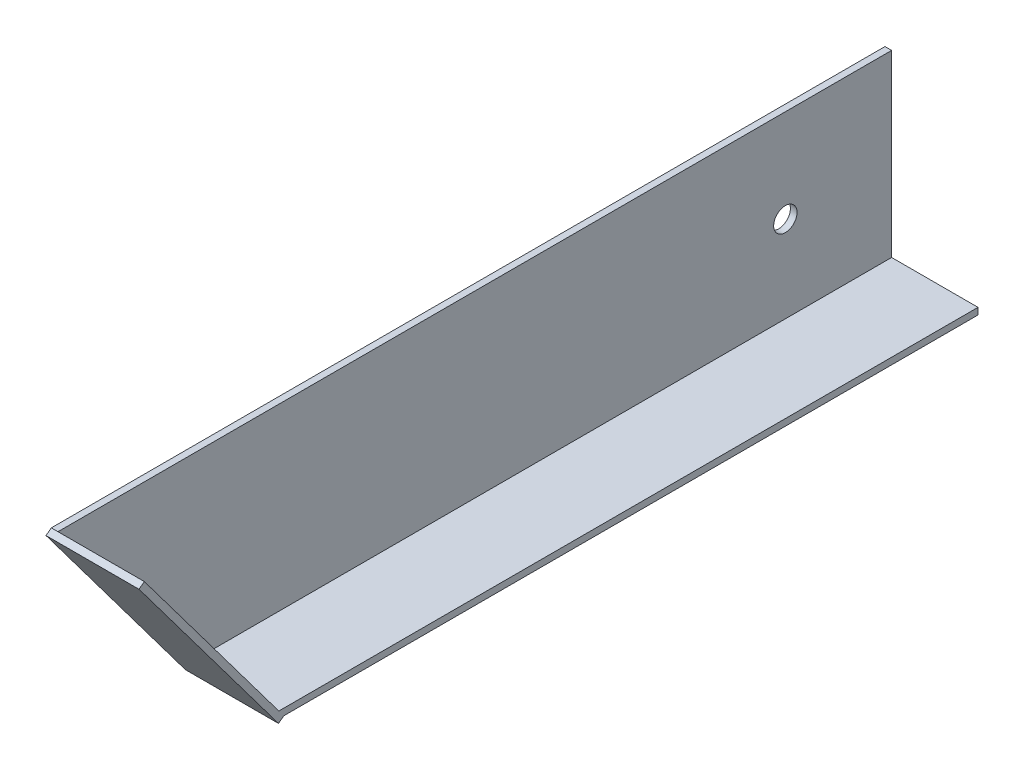
ISO-10303-21;
HEADER;
FILE_DESCRIPTION(('STEP AP214'),'2;1');
FILE_NAME('part.step','',(''),(''),'','','');
FILE_SCHEMA(('AUTOMOTIVE_DESIGN { 1 0 10303 214 1 1 1 1 }'));
ENDSEC;
DATA;
#1=APPLICATION_CONTEXT('core data for automotive mechanical design processes');
#2=APPLICATION_PROTOCOL_DEFINITION('international standard','automotive_design',2000,#1);
#3=PRODUCT_CONTEXT('',#1,'mechanical');
#4=PRODUCT('Part','Part','',(#3));
#5=PRODUCT_RELATED_PRODUCT_CATEGORY('part','',(#4));
#6=PRODUCT_DEFINITION_FORMATION('','',#4);
#7=PRODUCT_DEFINITION_CONTEXT('part definition',#1,'design');
#8=PRODUCT_DEFINITION('design','',#6,#7);
#9=PRODUCT_DEFINITION_SHAPE('','',#8);
#10=(LENGTH_UNIT() NAMED_UNIT(*) SI_UNIT(.MILLI.,.METRE.));
#11=(NAMED_UNIT(*) PLANE_ANGLE_UNIT() SI_UNIT($,.RADIAN.));
#12=(NAMED_UNIT(*) SI_UNIT($,.STERADIAN.) SOLID_ANGLE_UNIT());
#13=UNCERTAINTY_MEASURE_WITH_UNIT(LENGTH_MEASURE(1.E-05),#10,'distance_accuracy_value','');
#14=(GEOMETRIC_REPRESENTATION_CONTEXT(3) GLOBAL_UNCERTAINTY_ASSIGNED_CONTEXT((#13)) GLOBAL_UNIT_ASSIGNED_CONTEXT((#10,
#11,#12)) REPRESENTATION_CONTEXT('',''));
#15=CARTESIAN_POINT('',(0.,0.,0.));
#16=DIRECTION('',(0.,0.,1.));
#17=DIRECTION('',(1.,0.,0.));
#18=AXIS2_PLACEMENT_3D('',#15,#16,#17);
#19=CARTESIAN_POINT('',(0.,0.,199.23125));
#20=DIRECTION('',(1.,0.,0.));
#21=DIRECTION('',(0.,0.,-1.));
#22=AXIS2_PLACEMENT_3D('',#19,#20,#21);
#23=PLANE('',#22);
#24=DIRECTION('',(0.,0.,-1.));
#25=VECTOR('',#24,1.);
#26=CARTESIAN_POINT('',(0.,0.,199.23125));
#27=LINE('',#26,#25);
#28=CARTESIAN_POINT('',(0.,0.,132.556001855177));
#29=VERTEX_POINT('',#28);
#30=CARTESIAN_POINT('',(0.,0.,-199.23125));
#31=VERTEX_POINT('',#30);
#32=EDGE_CURVE('E11',#29,#31,#27,.T.);
#33=ORIENTED_EDGE('',*,*,#32,.F.);
#34=DIRECTION('',(0.,0.600001429132667,-0.799998928148505));
#35=VECTOR('',#34,1.);
#36=CARTESIAN_POINT('',(0.,-1.90500453749626,135.095998452048));
#37=LINE('',#36,#35);
#38=CARTESIAN_POINT('',(0.,-1.90500453749626,135.095998452048));
#39=VERTEX_POINT('',#38);
#40=EDGE_CURVE('E133',#39,#29,#37,.T.);
#41=ORIENTED_EDGE('',*,*,#40,.F.);
#42=DIRECTION('',(0.,-0.799998928148505,-0.600001429132667));
#43=VECTOR('',#42,1.);
#44=CARTESIAN_POINT('',(0.,-1.90500453749626,135.095998452048));
#45=LINE('',#44,#43);
#46=CARTESIAN_POINT('',(0.,86.9949954625037,201.771246596872));
#47=VERTEX_POINT('',#46);
#48=EDGE_CURVE('E149',#47,#39,#45,.T.);
#49=ORIENTED_EDGE('',*,*,#48,.F.);
#50=DIRECTION('',(0.,0.600001429132667,-0.799998928148505));
#51=VECTOR('',#50,1.);
#52=CARTESIAN_POINT('',(0.,86.9949954625037,201.771246596872));
#53=LINE('',#52,#51);
#54=CARTESIAN_POINT('',(0.,88.8999999999999,199.23125));
#55=VERTEX_POINT('',#54);
#56=EDGE_CURVE('E142',#47,#55,#53,.T.);
#57=ORIENTED_EDGE('',*,*,#56,.T.);
#58=DIRECTION('',(0.,0.,-1.));
#59=VECTOR('',#58,1.);
#60=CARTESIAN_POINT('',(0.,88.9,199.23125));
#61=LINE('',#60,#59);
#62=CARTESIAN_POINT('',(0.,88.9,-199.23125));
#63=VERTEX_POINT('',#62);
#64=EDGE_CURVE('E87',#55,#63,#61,.T.);
#65=ORIENTED_EDGE('',*,*,#64,.T.);
#66=DIRECTION('',(0.,-1.,0.));
#67=VECTOR('',#66,1.);
#68=CARTESIAN_POINT('',(0.,0.,-199.23125));
#69=LINE('',#68,#67);
#70=EDGE_CURVE('E93',#63,#31,#69,.T.);
#71=ORIENTED_EDGE('',*,*,#70,.T.);
#72=EDGE_LOOP('',(#33,#41,#49,#57,#65,#71));
#73=FACE_BOUND('',#72,.T.);
#74=CARTESIAN_POINT('',(0.,44.45,-148.43125));
#75=DIRECTION('',(1.,0.,0.));
#76=DIRECTION('',(0.,1.,0.));
#77=AXIS2_PLACEMENT_3D('',#74,#75,#76);
#78=CIRCLE('',#77,5.58800000000002);
#79=CARTESIAN_POINT('',(0.,50.038,-148.43125));
#80=VERTEX_POINT('',#79);
#81=EDGE_CURVE('E130',#80,#80,#78,.T.);
#82=ORIENTED_EDGE('',*,*,#81,.T.);
#83=EDGE_LOOP('',(#82));
#84=FACE_BOUND('',#83,.T.);
#85=ADVANCED_FACE('F33',(#73,#84),#23,.F.);
#86=CARTESIAN_POINT('',(0.,0.,199.23125));
#87=DIRECTION('',(0.,1.,0.));
#88=DIRECTION('',(0.,0.,1.));
#89=AXIS2_PLACEMENT_3D('',#86,#87,#88);
#90=PLANE('',#89);
#91=DIRECTION('',(-1.,0.,0.));
#92=VECTOR('',#91,1.);
#93=CARTESIAN_POINT('',(44.45,0.,132.556001855177));
#94=LINE('',#93,#92);
#95=CARTESIAN_POINT('',(44.45,0.,132.556001855177));
#96=VERTEX_POINT('',#95);
#97=EDGE_CURVE('E131',#96,#29,#94,.T.);
#98=ORIENTED_EDGE('',*,*,#97,.T.);
#99=ORIENTED_EDGE('',*,*,#32,.T.);
#100=DIRECTION('',(1.,0.,0.));
#101=VECTOR('',#100,1.);
#102=CARTESIAN_POINT('',(0.,0.,-199.23125));
#103=LINE('',#102,#101);
#104=CARTESIAN_POINT('',(44.45,0.,-199.23125));
#105=VERTEX_POINT('',#104);
#106=EDGE_CURVE('E118',#31,#105,#103,.T.);
#107=ORIENTED_EDGE('',*,*,#106,.T.);
#108=DIRECTION('',(0.,0.,-1.));
#109=VECTOR('',#108,1.);
#110=CARTESIAN_POINT('',(44.45,0.,199.23125));
#111=LINE('',#110,#109);
#112=EDGE_CURVE('E42',#96,#105,#111,.T.);
#113=ORIENTED_EDGE('',*,*,#112,.F.);
#114=EDGE_LOOP('',(#98,#99,#107,#113));
#115=FACE_BOUND('',#114,.T.);
#116=ADVANCED_FACE('F119',(#115),#90,.F.);
#117=CARTESIAN_POINT('',(44.45,0.,199.23125));
#118=DIRECTION('',(-1.,0.,0.));
#119=DIRECTION('',(0.,0.,1.));
#120=AXIS2_PLACEMENT_3D('',#117,#118,#119);
#121=PLANE('',#120);
#122=DIRECTION('',(0.,0.,-1.));
#123=VECTOR('',#122,1.);
#124=CARTESIAN_POINT('',(44.45,3.175,199.23125));
#125=LINE('',#124,#123);
#126=CARTESIAN_POINT('',(44.45,3.17500000000001,134.937260717492));
#127=VERTEX_POINT('',#126);
#128=CARTESIAN_POINT('',(44.45,3.175,-199.23125));
#129=VERTEX_POINT('',#128);
#130=EDGE_CURVE('E100',#127,#129,#125,.T.);
#131=ORIENTED_EDGE('',*,*,#130,.F.);
#132=DIRECTION('',(0.,0.799998928148505,0.600001429132667));
#133=VECTOR('',#132,1.);
#134=CARTESIAN_POINT('',(44.45,0.,132.556001855177));
#135=LINE('',#134,#133);
#136=CARTESIAN_POINT('',(44.45,88.8999999999999,199.23125));
#137=VERTEX_POINT('',#136);
#138=EDGE_CURVE('E150',#127,#137,#135,.T.);
#139=ORIENTED_EDGE('',*,*,#138,.T.);
#140=DIRECTION('',(0.,0.600001429132667,-0.799998928148505));
#141=VECTOR('',#140,1.);
#142=CARTESIAN_POINT('',(44.45,86.9949954625037,201.771246596872));
#143=LINE('',#142,#141);
#144=CARTESIAN_POINT('',(44.45,86.9949954625037,201.771246596872));
#145=VERTEX_POINT('',#144);
#146=EDGE_CURVE('E139',#145,#137,#143,.T.);
#147=ORIENTED_EDGE('',*,*,#146,.F.);
#148=DIRECTION('',(0.,0.799998928148505,0.600001429132667));
#149=VECTOR('',#148,1.);
#150=CARTESIAN_POINT('',(44.45,-1.90500453749626,135.095998452048));
#151=LINE('',#150,#149);
#152=CARTESIAN_POINT('',(44.45,-1.90500453749626,135.095998452048));
#153=VERTEX_POINT('',#152);
#154=EDGE_CURVE('E155',#153,#145,#151,.T.);
#155=ORIENTED_EDGE('',*,*,#154,.F.);
#156=DIRECTION('',(0.,0.600001429132667,-0.799998928148505));
#157=VECTOR('',#156,1.);
#158=CARTESIAN_POINT('',(44.45,-1.90500453749626,135.095998452048));
#159=LINE('',#158,#157);
#160=EDGE_CURVE('E114',#153,#96,#159,.T.);
#161=ORIENTED_EDGE('',*,*,#160,.T.);
#162=ORIENTED_EDGE('',*,*,#112,.T.);
#163=DIRECTION('',(0.,1.,0.));
#164=VECTOR('',#163,1.);
#165=CARTESIAN_POINT('',(44.45,0.,-199.23125));
#166=LINE('',#165,#164);
#167=EDGE_CURVE('E110',#105,#129,#166,.T.);
#168=ORIENTED_EDGE('',*,*,#167,.T.);
#169=EDGE_LOOP('',(#131,#139,#147,#155,#161,#162,#168));
#170=FACE_BOUND('',#169,.T.);
#171=ADVANCED_FACE('F108',(#170),#121,.F.);
#172=CARTESIAN_POINT('',(3.17500000000001,3.175,199.23125));
#173=DIRECTION('',(0.,-1.,0.));
#174=DIRECTION('',(0.,0.,-1.));
#175=AXIS2_PLACEMENT_3D('',#172,#173,#174);
#176=PLANE('',#175);
#177=DIRECTION('',(-1.,0.,0.));
#178=VECTOR('',#177,1.);
#179=CARTESIAN_POINT('',(3.175,3.175,134.937260717492));
#180=LINE('',#179,#178);
#181=CARTESIAN_POINT('',(3.17500000000001,3.175,134.937260717492));
#182=VERTEX_POINT('',#181);
#183=EDGE_CURVE('E125',#127,#182,#180,.T.);
#184=ORIENTED_EDGE('',*,*,#183,.F.);
#185=ORIENTED_EDGE('',*,*,#130,.T.);
#186=DIRECTION('',(-1.,0.,0.));
#187=VECTOR('',#186,1.);
#188=CARTESIAN_POINT('',(3.17500000000001,3.175,-199.23125));
#189=LINE('',#188,#187);
#190=CARTESIAN_POINT('',(3.17500000000001,3.175,-199.23125));
#191=VERTEX_POINT('',#190);
#192=EDGE_CURVE('E78',#129,#191,#189,.T.);
#193=ORIENTED_EDGE('',*,*,#192,.T.);
#194=DIRECTION('',(0.,0.,-1.));
#195=VECTOR('',#194,1.);
#196=CARTESIAN_POINT('',(3.17500000000001,3.175,199.23125));
#197=LINE('',#196,#195);
#198=EDGE_CURVE('E72',#182,#191,#197,.T.);
#199=ORIENTED_EDGE('',*,*,#198,.F.);
#200=EDGE_LOOP('',(#184,#185,#193,#199));
#201=FACE_BOUND('',#200,.T.);
#202=ADVANCED_FACE('F190',(#201),#176,.F.);
#203=CARTESIAN_POINT('',(3.175,88.9,199.23125));
#204=DIRECTION('',(-1.,0.,0.));
#205=DIRECTION('',(0.,-1.,0.));
#206=AXIS2_PLACEMENT_3D('',#203,#204,#205);
#207=PLANE('',#206);
#208=DIRECTION('',(0.,0.799998928148505,0.600001429132667));
#209=VECTOR('',#208,1.);
#210=CARTESIAN_POINT('',(3.175,88.9,199.23125));
#211=LINE('',#210,#209);
#212=CARTESIAN_POINT('',(3.175,88.9,199.23125));
#213=VERTEX_POINT('',#212);
#214=EDGE_CURVE('E128',#182,#213,#211,.T.);
#215=ORIENTED_EDGE('',*,*,#214,.F.);
#216=ORIENTED_EDGE('',*,*,#198,.T.);
#217=DIRECTION('',(0.,1.,0.));
#218=VECTOR('',#217,1.);
#219=CARTESIAN_POINT('',(3.175,88.9,-199.23125));
#220=LINE('',#219,#218);
#221=CARTESIAN_POINT('',(3.175,88.9,-199.23125));
#222=VERTEX_POINT('',#221);
#223=EDGE_CURVE('E68',#191,#222,#220,.T.);
#224=ORIENTED_EDGE('',*,*,#223,.T.);
#225=DIRECTION('',(0.,0.,-1.));
#226=VECTOR('',#225,1.);
#227=CARTESIAN_POINT('',(3.175,88.9,199.23125));
#228=LINE('',#227,#226);
#229=EDGE_CURVE('E49',#213,#222,#228,.T.);
#230=ORIENTED_EDGE('',*,*,#229,.F.);
#231=EDGE_LOOP('',(#215,#216,#224,#230));
#232=FACE_BOUND('',#231,.T.);
#233=CARTESIAN_POINT('',(3.175,44.45,-148.43125));
#234=DIRECTION('',(-1.,0.,0.));
#235=DIRECTION('',(0.,-1.,0.));
#236=AXIS2_PLACEMENT_3D('',#233,#234,#235);
#237=CIRCLE('',#236,5.58800000000002);
#238=CARTESIAN_POINT('',(3.17500000000001,38.862,-148.43125));
#239=VERTEX_POINT('',#238);
#240=EDGE_CURVE('E36',#239,#239,#237,.F.);
#241=ORIENTED_EDGE('',*,*,#240,.F.);
#242=EDGE_LOOP('',(#241));
#243=FACE_BOUND('',#242,.T.);
#244=ADVANCED_FACE('F69',(#232,#243),#207,.F.);
#245=CARTESIAN_POINT('',(0.,88.9,199.23125));
#246=DIRECTION('',(0.,-1.,0.));
#247=DIRECTION('',(0.,0.,-1.));
#248=AXIS2_PLACEMENT_3D('',#245,#246,#247);
#249=PLANE('',#248);
#250=DIRECTION('',(-1.,0.,0.));
#251=VECTOR('',#250,1.);
#252=CARTESIAN_POINT('',(0.,88.9,-199.23125));
#253=LINE('',#252,#251);
#254=EDGE_CURVE('E77',#222,#63,#253,.T.);
#255=ORIENTED_EDGE('',*,*,#254,.T.);
#256=ORIENTED_EDGE('',*,*,#64,.F.);
#257=DIRECTION('',(-1.,0.,0.));
#258=VECTOR('',#257,1.);
#259=CARTESIAN_POINT('',(0.,88.9,199.23125));
#260=LINE('',#259,#258);
#261=EDGE_CURVE('E85',#213,#55,#260,.T.);
#262=ORIENTED_EDGE('',*,*,#261,.F.);
#263=ORIENTED_EDGE('',*,*,#229,.T.);
#264=EDGE_LOOP('',(#255,#256,#262,#263));
#265=FACE_BOUND('',#264,.T.);
#266=ADVANCED_FACE('F81',(#265),#249,.F.);
#267=CARTESIAN_POINT('',(0.,0.,-199.23125));
#268=DIRECTION('',(0.,0.,-1.));
#269=DIRECTION('',(-1.,0.,0.));
#270=AXIS2_PLACEMENT_3D('',#267,#268,#269);
#271=PLANE('',#270);
#272=ORIENTED_EDGE('',*,*,#70,.F.);
#273=ORIENTED_EDGE('',*,*,#254,.F.);
#274=ORIENTED_EDGE('',*,*,#223,.F.);
#275=ORIENTED_EDGE('',*,*,#192,.F.);
#276=ORIENTED_EDGE('',*,*,#167,.F.);
#277=ORIENTED_EDGE('',*,*,#106,.F.);
#278=EDGE_LOOP('',(#272,#273,#274,#275,#276,#277));
#279=FACE_BOUND('',#278,.T.);
#280=ADVANCED_FACE('F90',(#279),#271,.T.);
#281=CARTESIAN_POINT('',(44.45,44.45,-148.43125));
#282=DIRECTION('',(-1.,0.,0.));
#283=DIRECTION('',(0.,-1.,0.));
#284=AXIS2_PLACEMENT_3D('',#281,#282,#283);
#285=CYLINDRICAL_SURFACE('',#284,5.58800000000002);
#286=ORIENTED_EDGE('',*,*,#81,.F.);
#287=EDGE_LOOP('',(#286));
#288=FACE_BOUND('',#287,.T.);
#289=ORIENTED_EDGE('',*,*,#240,.T.);
#290=EDGE_LOOP('',(#289));
#291=FACE_BOUND('',#290,.T.);
#292=ADVANCED_FACE('F225',(#288,#291),#285,.F.);
#293=CARTESIAN_POINT('',(0.,-63.6269471941627,84.8356138589076));
#294=DIRECTION('',(0.,0.600001429132667,-0.799998928148505));
#295=DIRECTION('',(0.,0.799998928148505,0.600001429132667));
#296=AXIS2_PLACEMENT_3D('',#293,#294,#295);
#297=PLANE('',#296);
#298=ORIENTED_EDGE('',*,*,#183,.T.);
#299=ORIENTED_EDGE('',*,*,#214,.T.);
#300=DIRECTION('',(-1.,0.,0.));
#301=VECTOR('',#300,1.);
#302=CARTESIAN_POINT('',(0.,88.8999999999999,199.23125));
#303=LINE('',#302,#301);
#304=EDGE_CURVE('E146',#137,#213,#303,.T.);
#305=ORIENTED_EDGE('',*,*,#304,.F.);
#306=ORIENTED_EDGE('',*,*,#138,.F.);
#307=EDGE_LOOP('',(#298,#299,#305,#306));
#308=FACE_BOUND('',#307,.T.);
#309=ADVANCED_FACE('F192',(#308),#297,.T.);
#310=CARTESIAN_POINT('',(0.,-1.90500453749626,135.095998452048));
#311=DIRECTION('',(0.,0.799998928148505,0.600001429132667));
#312=DIRECTION('',(0.,-0.600001429132668,0.799998928148505));
#313=AXIS2_PLACEMENT_3D('',#310,#311,#312);
#314=PLANE('',#313);
#315=ORIENTED_EDGE('',*,*,#97,.F.);
#316=ORIENTED_EDGE('',*,*,#160,.F.);
#317=DIRECTION('',(1.,0.,0.));
#318=VECTOR('',#317,1.);
#319=CARTESIAN_POINT('',(0.,-1.90500453749626,135.095998452048));
#320=LINE('',#319,#318);
#321=EDGE_CURVE('E158',#39,#153,#320,.T.);
#322=ORIENTED_EDGE('',*,*,#321,.F.);
#323=ORIENTED_EDGE('',*,*,#40,.T.);
#324=EDGE_LOOP('',(#315,#316,#322,#323));
#325=FACE_BOUND('',#324,.T.);
#326=ADVANCED_FACE('F178',(#325),#314,.F.);
#327=CARTESIAN_POINT('',(0.,86.9949954625037,201.771246596872));
#328=DIRECTION('',(0.,-0.799998928148505,-0.600001429132668));
#329=DIRECTION('',(0.,0.600001429132668,-0.799998928148505));
#330=AXIS2_PLACEMENT_3D('',#327,#328,#329);
#331=PLANE('',#330);
#332=ORIENTED_EDGE('',*,*,#304,.T.);
#333=ORIENTED_EDGE('',*,*,#261,.T.);
#334=ORIENTED_EDGE('',*,*,#56,.F.);
#335=DIRECTION('',(-1.,0.,0.));
#336=VECTOR('',#335,1.);
#337=CARTESIAN_POINT('',(0.,86.9949954625037,201.771246596872));
#338=LINE('',#337,#336);
#339=EDGE_CURVE('E145',#145,#47,#338,.T.);
#340=ORIENTED_EDGE('',*,*,#339,.F.);
#341=ORIENTED_EDGE('',*,*,#146,.T.);
#342=EDGE_LOOP('',(#332,#333,#334,#340,#341));
#343=FACE_BOUND('',#342,.T.);
#344=ADVANCED_FACE('F196',(#343),#331,.F.);
#345=CARTESIAN_POINT('',(0.,-65.5319517316589,87.3756104557791));
#346=DIRECTION('',(0.,0.600001429132667,-0.799998928148505));
#347=DIRECTION('',(0.,0.799998928148505,0.600001429132667));
#348=AXIS2_PLACEMENT_3D('',#345,#346,#347);
#349=PLANE('',#348);
#350=ORIENTED_EDGE('',*,*,#48,.T.);
#351=ORIENTED_EDGE('',*,*,#321,.T.);
#352=ORIENTED_EDGE('',*,*,#154,.T.);
#353=ORIENTED_EDGE('',*,*,#339,.T.);
#354=EDGE_LOOP('',(#350,#351,#352,#353));
#355=FACE_BOUND('',#354,.T.);
#356=ADVANCED_FACE('F166',(#355),#349,.F.);
#357=CLOSED_SHELL('',(#85,#116,#171,#202,#244,#266,#280,#292,#309,#326,#344,#356));
#358=MANIFOLD_SOLID_BREP('B2',#357);
#359=ADVANCED_BREP_SHAPE_REPRESENTATION('',(#18,#358),#14);
#360=SHAPE_DEFINITION_REPRESENTATION(#9,#359);
ENDSEC;
END-ISO-10303-21;
